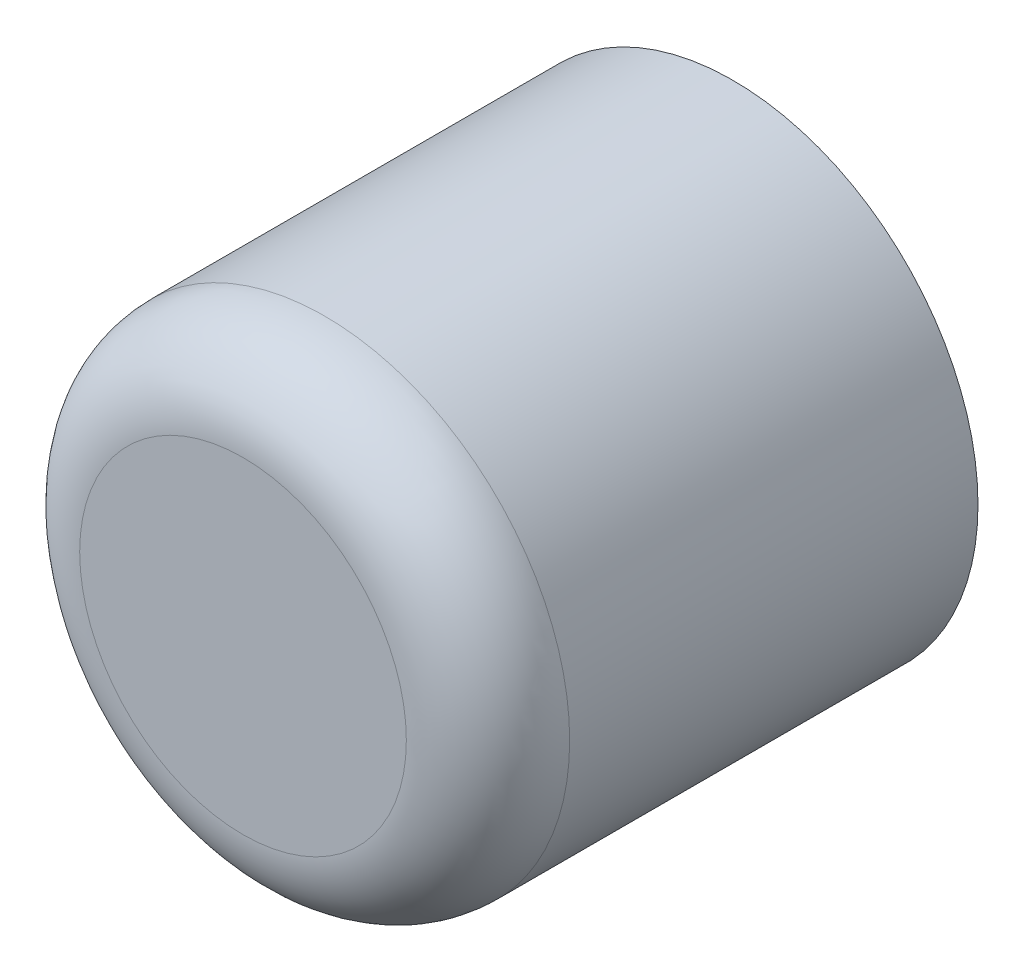
ISO-10303-21;
HEADER;
FILE_DESCRIPTION(('STEP AP214'),'2;1');
FILE_NAME('part.step','',(''),(''),'','','');
FILE_SCHEMA(('AUTOMOTIVE_DESIGN { 1 0 10303 214 1 1 1 1 }'));
ENDSEC;
DATA;
#1=APPLICATION_CONTEXT('core data for automotive mechanical design processes');
#2=APPLICATION_PROTOCOL_DEFINITION('international standard','automotive_design',2000,#1);
#3=PRODUCT_CONTEXT('',#1,'mechanical');
#4=PRODUCT('Part','Part','',(#3));
#5=PRODUCT_RELATED_PRODUCT_CATEGORY('part','',(#4));
#6=PRODUCT_DEFINITION_FORMATION('','',#4);
#7=PRODUCT_DEFINITION_CONTEXT('part definition',#1,'design');
#8=PRODUCT_DEFINITION('design','',#6,#7);
#9=PRODUCT_DEFINITION_SHAPE('','',#8);
#10=(LENGTH_UNIT() NAMED_UNIT(*) SI_UNIT(.MILLI.,.METRE.));
#11=(NAMED_UNIT(*) PLANE_ANGLE_UNIT() SI_UNIT($,.RADIAN.));
#12=(NAMED_UNIT(*) SI_UNIT($,.STERADIAN.) SOLID_ANGLE_UNIT());
#13=UNCERTAINTY_MEASURE_WITH_UNIT(LENGTH_MEASURE(1.E-05),#10,'distance_accuracy_value','');
#14=(GEOMETRIC_REPRESENTATION_CONTEXT(3) GLOBAL_UNCERTAINTY_ASSIGNED_CONTEXT((#13)) GLOBAL_UNIT_ASSIGNED_CONTEXT((#10,
#11,#12)) REPRESENTATION_CONTEXT('',''));
#15=CARTESIAN_POINT('',(0.,0.,0.));
#16=DIRECTION('',(0.,0.,1.));
#17=DIRECTION('',(1.,0.,0.));
#18=AXIS2_PLACEMENT_3D('',#15,#16,#17);
#19=CARTESIAN_POINT('',(0.,0.,6.));
#20=DIRECTION('',(0.,0.,-1.));
#21=DIRECTION('',(-1.,0.,0.));
#22=AXIS2_PLACEMENT_3D('',#19,#20,#21);
#23=CYLINDRICAL_SURFACE('',#22,3.);
#24=CARTESIAN_POINT('',(0.,0.,5.));
#25=DIRECTION('',(0.,0.,1.));
#26=DIRECTION('',(1.,0.,0.));
#27=AXIS2_PLACEMENT_3D('',#24,#25,#26);
#28=CIRCLE('',#27,3.);
#29=CARTESIAN_POINT('',(3.,0.,5.));
#30=VERTEX_POINT('',#29);
#31=EDGE_CURVE('E11',#30,#30,#28,.F.);
#32=ORIENTED_EDGE('',*,*,#31,.T.);
#33=EDGE_LOOP('',(#32));
#34=FACE_BOUND('',#33,.T.);
#35=CARTESIAN_POINT('',(0.,0.,0.));
#36=DIRECTION('',(0.,0.,1.));
#37=DIRECTION('',(1.,0.,0.));
#38=AXIS2_PLACEMENT_3D('',#35,#36,#37);
#39=CIRCLE('',#38,3.);
#40=CARTESIAN_POINT('',(3.,0.,0.));
#41=VERTEX_POINT('',#40);
#42=EDGE_CURVE('E154',#41,#41,#39,.T.);
#43=ORIENTED_EDGE('',*,*,#42,.T.);
#44=EDGE_LOOP('',(#43));
#45=FACE_BOUND('',#44,.T.);
#46=ADVANCED_FACE('F39',(#34,#45),#23,.T.);
#47=CARTESIAN_POINT('',(0.,0.,6.));
#48=DIRECTION('',(0.,0.,1.));
#49=DIRECTION('',(1.,0.,0.));
#50=AXIS2_PLACEMENT_3D('',#47,#48,#49);
#51=PLANE('',#50);
#52=CARTESIAN_POINT('',(0.,0.,6.));
#53=DIRECTION('',(0.,0.,1.));
#54=DIRECTION('',(1.,0.,0.));
#55=AXIS2_PLACEMENT_3D('',#52,#53,#54);
#56=CIRCLE('',#55,2.);
#57=CARTESIAN_POINT('',(2.,0.,6.));
#58=VERTEX_POINT('',#57);
#59=EDGE_CURVE('E48',#58,#58,#56,.T.);
#60=ORIENTED_EDGE('',*,*,#59,.T.);
#61=EDGE_LOOP('',(#60));
#62=FACE_BOUND('',#61,.T.);
#63=ADVANCED_FACE('F170',(#62),#51,.T.);
#64=CARTESIAN_POINT('',(0.,0.,0.));
#65=DIRECTION('',(0.,0.,1.));
#66=DIRECTION('',(1.,0.,0.));
#67=AXIS2_PLACEMENT_3D('',#64,#65,#66);
#68=PLANE('',#67);
#69=DIRECTION('',(0.5,0.866025403784439,0.));
#70=VECTOR('',#69,1.);
#71=CARTESIAN_POINT('',(-1.73205080756888,0.,0.));
#72=LINE('',#71,#70);
#73=CARTESIAN_POINT('',(-1.73205080756888,0.,0.));
#74=VERTEX_POINT('',#73);
#75=CARTESIAN_POINT('',(-0.866025403784439,1.5,0.));
#76=VERTEX_POINT('',#75);
#77=EDGE_CURVE('E135',#74,#76,#72,.T.);
#78=ORIENTED_EDGE('',*,*,#77,.F.);
#79=DIRECTION('',(-0.5,0.866025403784439,0.));
#80=VECTOR('',#79,1.);
#81=CARTESIAN_POINT('',(-0.866025403784439,-1.5,0.));
#82=LINE('',#81,#80);
#83=CARTESIAN_POINT('',(-0.866025403784439,-1.5,0.));
#84=VERTEX_POINT('',#83);
#85=EDGE_CURVE('E55',#84,#74,#82,.T.);
#86=ORIENTED_EDGE('',*,*,#85,.F.);
#87=DIRECTION('',(-1.,0.,0.));
#88=VECTOR('',#87,1.);
#89=CARTESIAN_POINT('',(0.866025403784439,-1.5,0.));
#90=LINE('',#89,#88);
#91=CARTESIAN_POINT('',(0.866025403784439,-1.5,0.));
#92=VERTEX_POINT('',#91);
#93=EDGE_CURVE('E148',#92,#84,#90,.T.);
#94=ORIENTED_EDGE('',*,*,#93,.F.);
#95=DIRECTION('',(-0.5,-0.866025403784439,0.));
#96=VECTOR('',#95,1.);
#97=CARTESIAN_POINT('',(1.73205080756888,0.,0.));
#98=LINE('',#97,#96);
#99=CARTESIAN_POINT('',(1.73205080756888,0.,0.));
#100=VERTEX_POINT('',#99);
#101=EDGE_CURVE('E145',#100,#92,#98,.T.);
#102=ORIENTED_EDGE('',*,*,#101,.F.);
#103=DIRECTION('',(0.5,-0.866025403784439,0.));
#104=VECTOR('',#103,1.);
#105=CARTESIAN_POINT('',(0.866025403784439,1.5,0.));
#106=LINE('',#105,#104);
#107=CARTESIAN_POINT('',(0.866025403784439,1.5,0.));
#108=VERTEX_POINT('',#107);
#109=EDGE_CURVE('E103',#108,#100,#106,.T.);
#110=ORIENTED_EDGE('',*,*,#109,.F.);
#111=DIRECTION('',(1.,0.,0.));
#112=VECTOR('',#111,1.);
#113=CARTESIAN_POINT('',(-0.866025403784439,1.5,0.));
#114=LINE('',#113,#112);
#115=EDGE_CURVE('E139',#76,#108,#114,.T.);
#116=ORIENTED_EDGE('',*,*,#115,.F.);
#117=EDGE_LOOP('',(#78,#86,#94,#102,#110,#116));
#118=FACE_BOUND('',#117,.T.);
#119=ORIENTED_EDGE('',*,*,#42,.F.);
#120=EDGE_LOOP('',(#119));
#121=FACE_BOUND('',#120,.T.);
#122=ADVANCED_FACE('F174',(#118,#121),#68,.F.);
#123=CARTESIAN_POINT('',(0.,0.,5.));
#124=DIRECTION('',(0.,0.,1.));
#125=DIRECTION('',(1.,0.,0.));
#126=AXIS2_PLACEMENT_3D('',#123,#124,#125);
#127=TOROIDAL_SURFACE('',#126,2.,1.);
#128=ORIENTED_EDGE('',*,*,#31,.F.);
#129=EDGE_LOOP('',(#128));
#130=FACE_BOUND('',#129,.T.);
#131=ORIENTED_EDGE('',*,*,#59,.F.);
#132=EDGE_LOOP('',(#131));
#133=FACE_BOUND('',#132,.T.);
#134=ADVANCED_FACE('F41',(#130,#133),#127,.T.);
#135=CARTESIAN_POINT('',(-0.866025403784439,-1.5,1.5));
#136=DIRECTION('',(-0.866025403784439,-0.5,0.));
#137=DIRECTION('',(0.5,-0.866025403784439,0.));
#138=AXIS2_PLACEMENT_3D('',#135,#136,#137);
#139=PLANE('',#138);
#140=ORIENTED_EDGE('',*,*,#85,.T.);
#141=DIRECTION('',(0.,0.,-1.));
#142=VECTOR('',#141,1.);
#143=CARTESIAN_POINT('',(-1.73205080756888,0.,1.5));
#144=LINE('',#143,#142);
#145=CARTESIAN_POINT('',(-1.73205080756888,0.,1.5));
#146=VERTEX_POINT('',#145);
#147=EDGE_CURVE('E85',#146,#74,#144,.T.);
#148=ORIENTED_EDGE('',*,*,#147,.F.);
#149=DIRECTION('',(-0.5,0.866025403784439,0.));
#150=VECTOR('',#149,1.);
#151=CARTESIAN_POINT('',(-0.866025403784439,-1.5,1.5));
#152=LINE('',#151,#150);
#153=CARTESIAN_POINT('',(-0.866025403784439,-1.5,1.5));
#154=VERTEX_POINT('',#153);
#155=EDGE_CURVE('E151',#154,#146,#152,.T.);
#156=ORIENTED_EDGE('',*,*,#155,.F.);
#157=DIRECTION('',(0.,0.,-1.));
#158=VECTOR('',#157,1.);
#159=CARTESIAN_POINT('',(-0.866025403784439,-1.5,1.5));
#160=LINE('',#159,#158);
#161=EDGE_CURVE('E63',#154,#84,#160,.T.);
#162=ORIENTED_EDGE('',*,*,#161,.T.);
#163=EDGE_LOOP('',(#140,#148,#156,#162));
#164=FACE_BOUND('',#163,.T.);
#165=ADVANCED_FACE('F173',(#164),#139,.F.);
#166=CARTESIAN_POINT('',(0.866025403784439,-1.5,1.5));
#167=DIRECTION('',(0.,-1.,0.));
#168=DIRECTION('',(0.,0.,-1.));
#169=AXIS2_PLACEMENT_3D('',#166,#167,#168);
#170=PLANE('',#169);
#171=ORIENTED_EDGE('',*,*,#93,.T.);
#172=ORIENTED_EDGE('',*,*,#161,.F.);
#173=DIRECTION('',(-1.,0.,0.));
#174=VECTOR('',#173,1.);
#175=CARTESIAN_POINT('',(0.866025403784439,-1.5,1.5));
#176=LINE('',#175,#174);
#177=CARTESIAN_POINT('',(0.866025403784439,-1.5,1.5));
#178=VERTEX_POINT('',#177);
#179=EDGE_CURVE('E117',#178,#154,#176,.T.);
#180=ORIENTED_EDGE('',*,*,#179,.F.);
#181=DIRECTION('',(0.,0.,-1.));
#182=VECTOR('',#181,1.);
#183=CARTESIAN_POINT('',(0.866025403784439,-1.5,1.5));
#184=LINE('',#183,#182);
#185=EDGE_CURVE('E108',#178,#92,#184,.T.);
#186=ORIENTED_EDGE('',*,*,#185,.T.);
#187=EDGE_LOOP('',(#171,#172,#180,#186));
#188=FACE_BOUND('',#187,.T.);
#189=ADVANCED_FACE('F180',(#188),#170,.F.);
#190=CARTESIAN_POINT('',(1.73205080756888,0.,1.5));
#191=DIRECTION('',(0.866025403784439,-0.5,0.));
#192=DIRECTION('',(0.5,0.866025403784439,0.));
#193=AXIS2_PLACEMENT_3D('',#190,#191,#192);
#194=PLANE('',#193);
#195=ORIENTED_EDGE('',*,*,#101,.T.);
#196=ORIENTED_EDGE('',*,*,#185,.F.);
#197=DIRECTION('',(-0.5,-0.866025403784439,0.));
#198=VECTOR('',#197,1.);
#199=CARTESIAN_POINT('',(1.73205080756888,0.,1.5));
#200=LINE('',#199,#198);
#201=CARTESIAN_POINT('',(1.73205080756888,0.,1.5));
#202=VERTEX_POINT('',#201);
#203=EDGE_CURVE('E112',#202,#178,#200,.T.);
#204=ORIENTED_EDGE('',*,*,#203,.F.);
#205=DIRECTION('',(0.,0.,-1.));
#206=VECTOR('',#205,1.);
#207=CARTESIAN_POINT('',(1.73205080756888,0.,1.5));
#208=LINE('',#207,#206);
#209=EDGE_CURVE('E96',#202,#100,#208,.T.);
#210=ORIENTED_EDGE('',*,*,#209,.T.);
#211=EDGE_LOOP('',(#195,#196,#204,#210));
#212=FACE_BOUND('',#211,.T.);
#213=ADVANCED_FACE('F113',(#212),#194,.F.);
#214=CARTESIAN_POINT('',(0.866025403784439,1.5,1.5));
#215=DIRECTION('',(0.866025403784439,0.5,0.));
#216=DIRECTION('',(-0.5,0.866025403784439,0.));
#217=AXIS2_PLACEMENT_3D('',#214,#215,#216);
#218=PLANE('',#217);
#219=ORIENTED_EDGE('',*,*,#109,.T.);
#220=ORIENTED_EDGE('',*,*,#209,.F.);
#221=DIRECTION('',(0.5,-0.866025403784439,0.));
#222=VECTOR('',#221,1.);
#223=CARTESIAN_POINT('',(0.866025403784439,1.5,1.5));
#224=LINE('',#223,#222);
#225=CARTESIAN_POINT('',(0.866025403784439,1.5,1.5));
#226=VERTEX_POINT('',#225);
#227=EDGE_CURVE('E100',#226,#202,#224,.T.);
#228=ORIENTED_EDGE('',*,*,#227,.F.);
#229=DIRECTION('',(0.,0.,-1.));
#230=VECTOR('',#229,1.);
#231=CARTESIAN_POINT('',(0.866025403784439,1.5,1.5));
#232=LINE('',#231,#230);
#233=EDGE_CURVE('E109',#226,#108,#232,.T.);
#234=ORIENTED_EDGE('',*,*,#233,.T.);
#235=EDGE_LOOP('',(#219,#220,#228,#234));
#236=FACE_BOUND('',#235,.T.);
#237=ADVANCED_FACE('F98',(#236),#218,.F.);
#238=CARTESIAN_POINT('',(-0.866025403784439,1.5,1.5));
#239=DIRECTION('',(0.,1.,0.));
#240=DIRECTION('',(-1.,0.,0.));
#241=AXIS2_PLACEMENT_3D('',#238,#239,#240);
#242=PLANE('',#241);
#243=ORIENTED_EDGE('',*,*,#115,.T.);
#244=ORIENTED_EDGE('',*,*,#233,.F.);
#245=DIRECTION('',(1.,0.,0.));
#246=VECTOR('',#245,1.);
#247=CARTESIAN_POINT('',(-0.866025403784439,1.5,1.5));
#248=LINE('',#247,#246);
#249=CARTESIAN_POINT('',(-0.866025403784439,1.5,1.5));
#250=VERTEX_POINT('',#249);
#251=EDGE_CURVE('E123',#250,#226,#248,.T.);
#252=ORIENTED_EDGE('',*,*,#251,.F.);
#253=DIRECTION('',(0.,0.,-1.));
#254=VECTOR('',#253,1.);
#255=CARTESIAN_POINT('',(-0.866025403784439,1.5,1.5));
#256=LINE('',#255,#254);
#257=EDGE_CURVE('E159',#250,#76,#256,.T.);
#258=ORIENTED_EDGE('',*,*,#257,.T.);
#259=EDGE_LOOP('',(#243,#244,#252,#258));
#260=FACE_BOUND('',#259,.T.);
#261=ADVANCED_FACE('F196',(#260),#242,.F.);
#262=CARTESIAN_POINT('',(-1.73205080756888,0.,1.5));
#263=DIRECTION('',(-0.866025403784439,0.5,0.));
#264=DIRECTION('',(-0.5,-0.866025403784439,0.));
#265=AXIS2_PLACEMENT_3D('',#262,#263,#264);
#266=PLANE('',#265);
#267=ORIENTED_EDGE('',*,*,#77,.T.);
#268=ORIENTED_EDGE('',*,*,#257,.F.);
#269=DIRECTION('',(0.5,0.866025403784439,0.));
#270=VECTOR('',#269,1.);
#271=CARTESIAN_POINT('',(-1.73205080756888,0.,1.5));
#272=LINE('',#271,#270);
#273=EDGE_CURVE('E127',#146,#250,#272,.T.);
#274=ORIENTED_EDGE('',*,*,#273,.F.);
#275=ORIENTED_EDGE('',*,*,#147,.T.);
#276=EDGE_LOOP('',(#267,#268,#274,#275));
#277=FACE_BOUND('',#276,.T.);
#278=ADVANCED_FACE('F193',(#277),#266,.F.);
#279=CARTESIAN_POINT('',(0.,0.,1.5));
#280=DIRECTION('',(0.,0.,-1.));
#281=DIRECTION('',(-1.,0.,0.));
#282=AXIS2_PLACEMENT_3D('',#279,#280,#281);
#283=PLANE('',#282);
#284=ORIENTED_EDGE('',*,*,#155,.T.);
#285=ORIENTED_EDGE('',*,*,#273,.T.);
#286=ORIENTED_EDGE('',*,*,#251,.T.);
#287=ORIENTED_EDGE('',*,*,#227,.T.);
#288=ORIENTED_EDGE('',*,*,#203,.T.);
#289=ORIENTED_EDGE('',*,*,#179,.T.);
#290=EDGE_LOOP('',(#284,#285,#286,#287,#288,#289));
#291=FACE_BOUND('',#290,.T.);
#292=ADVANCED_FACE('F120',(#291),#283,.T.);
#293=CLOSED_SHELL('',(#46,#63,#122,#134,#165,#189,#213,#237,#261,#278,#292));
#294=MANIFOLD_SOLID_BREP('B2',#293);
#295=ADVANCED_BREP_SHAPE_REPRESENTATION('',(#18,#294),#14);
#296=SHAPE_DEFINITION_REPRESENTATION(#9,#295);
ENDSEC;
END-ISO-10303-21;
